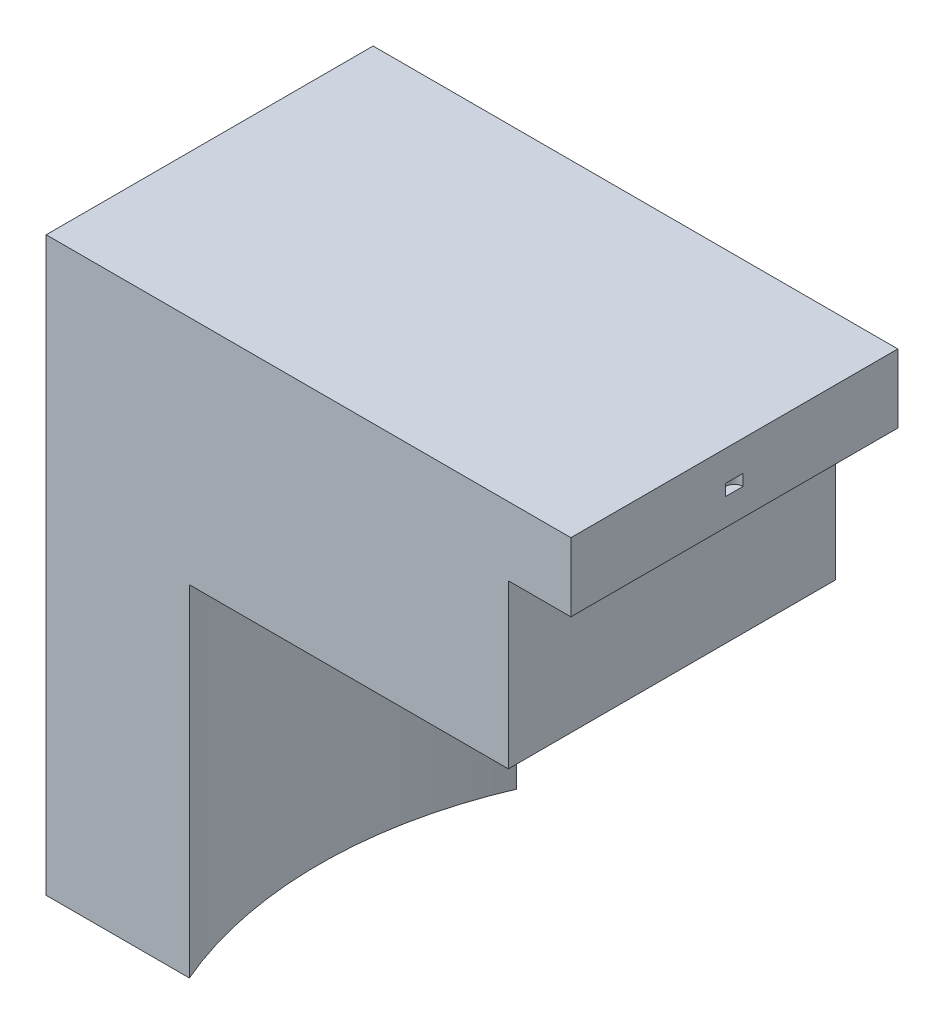
ISO-10303-21;
HEADER;
FILE_DESCRIPTION(('STEP AP214'),'2;1');
FILE_NAME('part.step','',(''),(''),'','','');
FILE_SCHEMA(('AUTOMOTIVE_DESIGN { 1 0 10303 214 1 1 1 1 }'));
ENDSEC;
DATA;
#1=APPLICATION_CONTEXT('core data for automotive mechanical design processes');
#2=APPLICATION_PROTOCOL_DEFINITION('international standard','automotive_design',2000,#1);
#3=PRODUCT_CONTEXT('',#1,'mechanical');
#4=PRODUCT('Part','Part','',(#3));
#5=PRODUCT_RELATED_PRODUCT_CATEGORY('part','',(#4));
#6=PRODUCT_DEFINITION_FORMATION('','',#4);
#7=PRODUCT_DEFINITION_CONTEXT('part definition',#1,'design');
#8=PRODUCT_DEFINITION('design','',#6,#7);
#9=PRODUCT_DEFINITION_SHAPE('','',#8);
#10=(LENGTH_UNIT() NAMED_UNIT(*) SI_UNIT(.MILLI.,.METRE.));
#11=(NAMED_UNIT(*) PLANE_ANGLE_UNIT() SI_UNIT($,.RADIAN.));
#12=(NAMED_UNIT(*) SI_UNIT($,.STERADIAN.) SOLID_ANGLE_UNIT());
#13=UNCERTAINTY_MEASURE_WITH_UNIT(LENGTH_MEASURE(1.E-05),#10,'distance_accuracy_value','');
#14=(GEOMETRIC_REPRESENTATION_CONTEXT(3) GLOBAL_UNCERTAINTY_ASSIGNED_CONTEXT((#13)) GLOBAL_UNIT_ASSIGNED_CONTEXT((#10,
#11,#12)) REPRESENTATION_CONTEXT('',''));
#15=CARTESIAN_POINT('',(0.,0.,0.));
#16=DIRECTION('',(0.,0.,1.));
#17=DIRECTION('',(1.,0.,0.));
#18=AXIS2_PLACEMENT_3D('',#15,#16,#17);
#19=CARTESIAN_POINT('',(0.,2.10095757795159,2.54));
#20=DIRECTION('',(-1.,0.,0.));
#21=DIRECTION('',(0.,0.,1.));
#22=AXIS2_PLACEMENT_3D('',#19,#20,#21);
#23=PLANE('',#22);
#24=DIRECTION('',(0.,1.,0.));
#25=VECTOR('',#24,1.);
#26=CARTESIAN_POINT('',(0.,5.64404138486413,0.135));
#27=LINE('',#26,#25);
#28=CARTESIAN_POINT('',(0.,2.51815975537895,0.135));
#29=VERTEX_POINT('',#28);
#30=CARTESIAN_POINT('',(0.,2.69512166525843,0.135));
#31=VERTEX_POINT('',#30);
#32=EDGE_CURVE('E47',#29,#31,#27,.T.);
#33=ORIENTED_EDGE('',*,*,#32,.T.);
#34=DIRECTION('',(0.,0.,-1.));
#35=VECTOR('',#34,1.);
#36=CARTESIAN_POINT('',(0.,2.69512166525843,2.54));
#37=LINE('',#36,#35);
#38=CARTESIAN_POINT('',(0.,2.69512166525843,-0.135));
#39=VERTEX_POINT('',#38);
#40=EDGE_CURVE('E11',#31,#39,#37,.T.);
#41=ORIENTED_EDGE('',*,*,#40,.T.);
#42=DIRECTION('',(0.,1.,0.));
#43=VECTOR('',#42,1.);
#44=CARTESIAN_POINT('',(0.,5.64404138486413,-0.135));
#45=LINE('',#44,#43);
#46=CARTESIAN_POINT('',(0.,2.51815975537895,-0.135));
#47=VERTEX_POINT('',#46);
#48=EDGE_CURVE('E143',#39,#47,#45,.F.);
#49=ORIENTED_EDGE('',*,*,#48,.T.);
#50=DIRECTION('',(0.,0.,1.));
#51=VECTOR('',#50,1.);
#52=CARTESIAN_POINT('',(0.,2.51815975537895,2.54));
#53=LINE('',#52,#51);
#54=EDGE_CURVE('E139',#47,#29,#53,.T.);
#55=ORIENTED_EDGE('',*,*,#54,.T.);
#56=EDGE_LOOP('',(#33,#41,#49,#55));
#57=FACE_BOUND('',#56,.T.);
#58=DIRECTION('',(0.,1.,0.));
#59=VECTOR('',#58,1.);
#60=CARTESIAN_POINT('',(0.,2.10095757795159,-2.54));
#61=LINE('',#60,#59);
#62=CARTESIAN_POINT('',(0.,2.10095757795159,-2.54));
#63=VERTEX_POINT('',#62);
#64=CARTESIAN_POINT('',(0.,3.16625856266991,-2.54));
#65=VERTEX_POINT('',#64);
#66=EDGE_CURVE('E171',#63,#65,#61,.T.);
#67=ORIENTED_EDGE('',*,*,#66,.T.);
#68=DIRECTION('',(0.,0.,-1.));
#69=VECTOR('',#68,1.);
#70=CARTESIAN_POINT('',(0.,3.16625856266991,2.54));
#71=LINE('',#70,#69);
#72=CARTESIAN_POINT('',(0.,3.16625856266991,2.54));
#73=VERTEX_POINT('',#72);
#74=EDGE_CURVE('E125',#73,#65,#71,.T.);
#75=ORIENTED_EDGE('',*,*,#74,.F.);
#76=DIRECTION('',(0.,1.,0.));
#77=VECTOR('',#76,1.);
#78=CARTESIAN_POINT('',(0.,2.10095757795159,2.54));
#79=LINE('',#78,#77);
#80=CARTESIAN_POINT('',(0.,2.10095757795159,2.54));
#81=VERTEX_POINT('',#80);
#82=EDGE_CURVE('E172',#81,#73,#79,.T.);
#83=ORIENTED_EDGE('',*,*,#82,.F.);
#84=DIRECTION('',(0.,0.,-1.));
#85=VECTOR('',#84,1.);
#86=CARTESIAN_POINT('',(0.,2.10095757795159,2.54));
#87=LINE('',#86,#85);
#88=EDGE_CURVE('E193',#81,#63,#87,.T.);
#89=ORIENTED_EDGE('',*,*,#88,.T.);
#90=EDGE_LOOP('',(#67,#75,#83,#89));
#91=FACE_BOUND('',#90,.T.);
#92=ADVANCED_FACE('F39',(#57,#91),#23,.F.);
#93=CARTESIAN_POINT('',(0.,3.16625856266991,2.54));
#94=DIRECTION('',(0.,-1.,0.));
#95=DIRECTION('',(0.,0.,-1.));
#96=AXIS2_PLACEMENT_3D('',#93,#94,#95);
#97=PLANE('',#96);
#98=DIRECTION('',(-1.,0.,0.));
#99=VECTOR('',#98,1.);
#100=CARTESIAN_POINT('',(0.,3.16625856266991,-2.54));
#101=LINE('',#100,#99);
#102=CARTESIAN_POINT('',(-8.15304288202867,3.16625856266991,-2.54));
#103=VERTEX_POINT('',#102);
#104=EDGE_CURVE('E197',#65,#103,#101,.T.);
#105=ORIENTED_EDGE('',*,*,#104,.T.);
#106=DIRECTION('',(0.,0.,-1.));
#107=VECTOR('',#106,1.);
#108=CARTESIAN_POINT('',(-8.15304288202867,3.16625856266991,2.54));
#109=LINE('',#108,#107);
#110=CARTESIAN_POINT('',(-8.15304288202867,3.16625856266991,2.54));
#111=VERTEX_POINT('',#110);
#112=EDGE_CURVE('E224',#111,#103,#109,.T.);
#113=ORIENTED_EDGE('',*,*,#112,.F.);
#114=DIRECTION('',(-1.,0.,0.));
#115=VECTOR('',#114,1.);
#116=CARTESIAN_POINT('',(0.,3.16625856266991,2.54));
#117=LINE('',#116,#115);
#118=EDGE_CURVE('E176',#73,#111,#117,.T.);
#119=ORIENTED_EDGE('',*,*,#118,.F.);
#120=ORIENTED_EDGE('',*,*,#74,.T.);
#121=EDGE_LOOP('',(#105,#113,#119,#120));
#122=FACE_BOUND('',#121,.T.);
#123=ADVANCED_FACE('F231',(#122),#97,.F.);
#124=CARTESIAN_POINT('',(-8.15304288202867,3.16625856266991,2.54));
#125=DIRECTION('',(1.,0.,0.));
#126=DIRECTION('',(0.,1.,0.));
#127=AXIS2_PLACEMENT_3D('',#124,#125,#126);
#128=PLANE('',#127);
#129=DIRECTION('',(0.,-1.,0.));
#130=VECTOR('',#129,1.);
#131=CARTESIAN_POINT('',(-8.15304288202867,3.16625856266991,-2.54));
#132=LINE('',#131,#130);
#133=CARTESIAN_POINT('',(-8.15304288202867,-5.72374143733008,-2.54));
#134=VERTEX_POINT('',#133);
#135=EDGE_CURVE('E200',#103,#134,#132,.T.);
#136=ORIENTED_EDGE('',*,*,#135,.T.);
#137=DIRECTION('',(0.,0.,-1.));
#138=VECTOR('',#137,1.);
#139=CARTESIAN_POINT('',(-8.15304288202867,-5.72374143733008,2.54));
#140=LINE('',#139,#138);
#141=CARTESIAN_POINT('',(-8.15304288202867,-5.72374143733008,2.54));
#142=VERTEX_POINT('',#141);
#143=EDGE_CURVE('E220',#142,#134,#140,.T.);
#144=ORIENTED_EDGE('',*,*,#143,.F.);
#145=DIRECTION('',(0.,-1.,0.));
#146=VECTOR('',#145,1.);
#147=CARTESIAN_POINT('',(-8.15304288202867,3.16625856266991,2.54));
#148=LINE('',#147,#146);
#149=EDGE_CURVE('E180',#111,#142,#148,.T.);
#150=ORIENTED_EDGE('',*,*,#149,.F.);
#151=ORIENTED_EDGE('',*,*,#112,.T.);
#152=EDGE_LOOP('',(#136,#144,#150,#151));
#153=FACE_BOUND('',#152,.T.);
#154=ADVANCED_FACE('F239',(#153),#128,.F.);
#155=CARTESIAN_POINT('',(-8.15304288202867,-5.72374143733008,2.54));
#156=DIRECTION('',(0.,1.,0.));
#157=DIRECTION('',(-1.,0.,0.));
#158=AXIS2_PLACEMENT_3D('',#155,#156,#157);
#159=PLANE('',#158);
#160=DIRECTION('',(1.,0.,0.));
#161=VECTOR('',#160,1.);
#162=CARTESIAN_POINT('',(-8.15304288202867,-5.72374143733008,-2.54));
#163=LINE('',#162,#161);
#164=CARTESIAN_POINT('',(-5.92881944403774,-5.72374143733008,-2.54));
#165=VERTEX_POINT('',#164);
#166=EDGE_CURVE('E203',#134,#165,#163,.T.);
#167=ORIENTED_EDGE('',*,*,#166,.T.);
#168=CARTESIAN_POINT('',(0.,-5.72374143733008,0.));
#169=DIRECTION('',(0.,1.,0.));
#170=DIRECTION('',(-1.,0.,0.));
#171=AXIS2_PLACEMENT_3D('',#168,#169,#170);
#172=CIRCLE('',#171,6.45);
#173=CARTESIAN_POINT('',(-5.92881944403774,-5.72374143733008,2.54));
#174=VERTEX_POINT('',#173);
#175=EDGE_CURVE('E61',#165,#174,#172,.T.);
#176=ORIENTED_EDGE('',*,*,#175,.T.);
#177=DIRECTION('',(1.,0.,0.));
#178=VECTOR('',#177,1.);
#179=CARTESIAN_POINT('',(-8.15304288202867,-5.72374143733008,2.54));
#180=LINE('',#179,#178);
#181=EDGE_CURVE('E183',#142,#174,#180,.T.);
#182=ORIENTED_EDGE('',*,*,#181,.F.);
#183=ORIENTED_EDGE('',*,*,#143,.T.);
#184=EDGE_LOOP('',(#167,#176,#182,#183));
#185=FACE_BOUND('',#184,.T.);
#186=ADVANCED_FACE('F243',(#185),#159,.F.);
#187=CARTESIAN_POINT('',(-0.971812771881578,-0.430777300864156,2.54));
#188=DIRECTION('',(-1.,0.,0.));
#189=DIRECTION('',(0.,0.,1.));
#190=AXIS2_PLACEMENT_3D('',#187,#188,#189);
#191=PLANE('',#190);
#192=DIRECTION('',(0.,1.,0.));
#193=VECTOR('',#192,1.);
#194=CARTESIAN_POINT('',(-0.971812771881578,-0.430777300864156,-2.54));
#195=LINE('',#194,#193);
#196=CARTESIAN_POINT('',(-0.971812771881578,-0.430777300864156,-2.54));
#197=VERTEX_POINT('',#196);
#198=CARTESIAN_POINT('',(-0.971812771881578,2.10095757795159,-2.54));
#199=VERTEX_POINT('',#198);
#200=EDGE_CURVE('E137',#197,#199,#195,.T.);
#201=ORIENTED_EDGE('',*,*,#200,.T.);
#202=DIRECTION('',(0.,0.,-1.));
#203=VECTOR('',#202,1.);
#204=CARTESIAN_POINT('',(-0.971812771881578,2.10095757795159,2.54));
#205=LINE('',#204,#203);
#206=CARTESIAN_POINT('',(-0.971812771881578,2.10095757795159,2.54));
#207=VERTEX_POINT('',#206);
#208=EDGE_CURVE('E213',#207,#199,#205,.T.);
#209=ORIENTED_EDGE('',*,*,#208,.F.);
#210=DIRECTION('',(0.,1.,0.));
#211=VECTOR('',#210,1.);
#212=CARTESIAN_POINT('',(-0.971812771881578,-0.430777300864156,2.54));
#213=LINE('',#212,#211);
#214=CARTESIAN_POINT('',(-0.971812771881578,-0.430777300864156,2.54));
#215=VERTEX_POINT('',#214);
#216=EDGE_CURVE('E187',#215,#207,#213,.T.);
#217=ORIENTED_EDGE('',*,*,#216,.F.);
#218=DIRECTION('',(0.,0.,-1.));
#219=VECTOR('',#218,1.);
#220=CARTESIAN_POINT('',(-0.971812771881578,-0.430777300864156,2.54));
#221=LINE('',#220,#219);
#222=EDGE_CURVE('E217',#215,#197,#221,.T.);
#223=ORIENTED_EDGE('',*,*,#222,.T.);
#224=EDGE_LOOP('',(#201,#209,#217,#223));
#225=FACE_BOUND('',#224,.T.);
#226=ADVANCED_FACE('F252',(#225),#191,.F.);
#227=CARTESIAN_POINT('',(-0.971812771881578,2.10095757795159,2.54));
#228=DIRECTION('',(0.,1.,0.));
#229=DIRECTION('',(0.,0.,1.));
#230=AXIS2_PLACEMENT_3D('',#227,#228,#229);
#231=PLANE('',#230);
#232=DIRECTION('',(1.,0.,0.));
#233=VECTOR('',#232,1.);
#234=CARTESIAN_POINT('',(-0.971812771881578,2.10095757795159,-2.54));
#235=LINE('',#234,#233);
#236=EDGE_CURVE('E177',#199,#63,#235,.T.);
#237=ORIENTED_EDGE('',*,*,#236,.T.);
#238=ORIENTED_EDGE('',*,*,#88,.F.);
#239=DIRECTION('',(1.,0.,0.));
#240=VECTOR('',#239,1.);
#241=CARTESIAN_POINT('',(-0.971812771881578,2.10095757795159,2.54));
#242=LINE('',#241,#240);
#243=EDGE_CURVE('E190',#207,#81,#242,.T.);
#244=ORIENTED_EDGE('',*,*,#243,.F.);
#245=ORIENTED_EDGE('',*,*,#208,.T.);
#246=EDGE_LOOP('',(#237,#238,#244,#245));
#247=FACE_BOUND('',#246,.T.);
#248=ADVANCED_FACE('F250',(#247),#231,.F.);
#249=CARTESIAN_POINT('',(0.,0.,2.54));
#250=DIRECTION('',(0.,0.,1.));
#251=DIRECTION('',(1.,0.,0.));
#252=AXIS2_PLACEMENT_3D('',#249,#250,#251);
#253=PLANE('',#252);
#254=DIRECTION('',(-1.,0.,0.));
#255=VECTOR('',#254,1.);
#256=CARTESIAN_POINT('',(0.,-0.430777300864156,2.54));
#257=LINE('',#256,#255);
#258=CARTESIAN_POINT('',(-5.92881944403774,-0.430777300864157,2.54));
#259=VERTEX_POINT('',#258);
#260=EDGE_CURVE('E131',#215,#259,#257,.T.);
#261=ORIENTED_EDGE('',*,*,#260,.F.);
#262=ORIENTED_EDGE('',*,*,#216,.T.);
#263=ORIENTED_EDGE('',*,*,#243,.T.);
#264=ORIENTED_EDGE('',*,*,#82,.T.);
#265=ORIENTED_EDGE('',*,*,#118,.T.);
#266=ORIENTED_EDGE('',*,*,#149,.T.);
#267=ORIENTED_EDGE('',*,*,#181,.T.);
#268=DIRECTION('',(0.,1.,0.));
#269=VECTOR('',#268,1.);
#270=CARTESIAN_POINT('',(-5.92881944403774,5.64404138486413,2.54));
#271=LINE('',#270,#269);
#272=EDGE_CURVE('E163',#259,#174,#271,.F.);
#273=ORIENTED_EDGE('',*,*,#272,.F.);
#274=EDGE_LOOP('',(#261,#262,#263,#264,#265,#266,#267,#273));
#275=FACE_BOUND('',#274,.T.);
#276=ADVANCED_FACE('F245',(#275),#253,.T.);
#277=CARTESIAN_POINT('',(0.,0.,-2.54));
#278=DIRECTION('',(0.,0.,1.));
#279=DIRECTION('',(1.,0.,0.));
#280=AXIS2_PLACEMENT_3D('',#277,#278,#279);
#281=PLANE('',#280);
#282=ORIENTED_EDGE('',*,*,#200,.F.);
#283=DIRECTION('',(-1.,0.,0.));
#284=VECTOR('',#283,1.);
#285=CARTESIAN_POINT('',(0.,-0.430777300864156,-2.54));
#286=LINE('',#285,#284);
#287=CARTESIAN_POINT('',(-5.92881944403774,-0.430777300864157,-2.54));
#288=VERTEX_POINT('',#287);
#289=EDGE_CURVE('E124',#197,#288,#286,.T.);
#290=ORIENTED_EDGE('',*,*,#289,.T.);
#291=DIRECTION('',(0.,1.,0.));
#292=VECTOR('',#291,1.);
#293=CARTESIAN_POINT('',(-5.92881944403774,5.64404138486413,-2.54));
#294=LINE('',#293,#292);
#295=EDGE_CURVE('E114',#288,#165,#294,.F.);
#296=ORIENTED_EDGE('',*,*,#295,.T.);
#297=ORIENTED_EDGE('',*,*,#166,.F.);
#298=ORIENTED_EDGE('',*,*,#135,.F.);
#299=ORIENTED_EDGE('',*,*,#104,.F.);
#300=ORIENTED_EDGE('',*,*,#66,.F.);
#301=ORIENTED_EDGE('',*,*,#236,.F.);
#302=EDGE_LOOP('',(#282,#290,#296,#297,#298,#299,#300,#301));
#303=FACE_BOUND('',#302,.T.);
#304=ADVANCED_FACE('F135',(#303),#281,.F.);
#305=CARTESIAN_POINT('',(0.,-0.430777300864156,0.));
#306=DIRECTION('',(0.,1.,0.));
#307=DIRECTION('',(0.,0.,1.));
#308=AXIS2_PLACEMENT_3D('',#305,#306,#307);
#309=PLANE('',#308);
#310=ORIENTED_EDGE('',*,*,#260,.T.);
#311=CARTESIAN_POINT('',(0.,-0.430777300864157,0.));
#312=DIRECTION('',(0.,1.,0.));
#313=DIRECTION('',(0.,0.,1.));
#314=AXIS2_PLACEMENT_3D('',#311,#312,#313);
#315=CIRCLE('',#314,6.45);
#316=EDGE_CURVE('E117',#288,#259,#315,.T.);
#317=ORIENTED_EDGE('',*,*,#316,.F.);
#318=ORIENTED_EDGE('',*,*,#289,.F.);
#319=ORIENTED_EDGE('',*,*,#222,.F.);
#320=EDGE_LOOP('',(#310,#317,#318,#319));
#321=FACE_BOUND('',#320,.T.);
#322=ADVANCED_FACE('F128',(#321),#309,.F.);
#323=CARTESIAN_POINT('',(0.,5.64404138486413,0.));
#324=DIRECTION('',(0.,1.,0.));
#325=DIRECTION('',(0.,0.,1.));
#326=AXIS2_PLACEMENT_3D('',#323,#324,#325);
#327=CYLINDRICAL_SURFACE('',#326,6.45);
#328=ORIENTED_EDGE('',*,*,#272,.T.);
#329=ORIENTED_EDGE('',*,*,#175,.F.);
#330=ORIENTED_EDGE('',*,*,#295,.F.);
#331=ORIENTED_EDGE('',*,*,#316,.T.);
#332=EDGE_LOOP('',(#328,#329,#330,#331));
#333=FACE_BOUND('',#332,.T.);
#334=ADVANCED_FACE('F116',(#333),#327,.F.);
#335=CARTESIAN_POINT('',(0.,2.69512166525843,0.));
#336=DIRECTION('',(0.,1.,0.));
#337=DIRECTION('',(0.,0.,1.));
#338=AXIS2_PLACEMENT_3D('',#335,#336,#337);
#339=PLANE('',#338);
#340=CARTESIAN_POINT('',(0.,2.69512166525843,0.));
#341=DIRECTION('',(0.,1.,0.));
#342=DIRECTION('',(0.,0.,1.));
#343=AXIS2_PLACEMENT_3D('',#340,#341,#342);
#344=CIRCLE('',#343,0.135);
#345=EDGE_CURVE('E157',#39,#31,#344,.T.);
#346=ORIENTED_EDGE('',*,*,#345,.F.);
#347=ORIENTED_EDGE('',*,*,#40,.F.);
#348=EDGE_LOOP('',(#346,#347));
#349=FACE_BOUND('',#348,.T.);
#350=ADVANCED_FACE('F316',(#349),#339,.F.);
#351=CARTESIAN_POINT('',(0.,5.64404138486413,0.));
#352=DIRECTION('',(0.,1.,0.));
#353=DIRECTION('',(0.,0.,1.));
#354=AXIS2_PLACEMENT_3D('',#351,#352,#353);
#355=CYLINDRICAL_SURFACE('',#354,0.135);
#356=CARTESIAN_POINT('',(0.,2.51815975537895,0.));
#357=DIRECTION('',(0.,1.,0.));
#358=DIRECTION('',(0.,0.,1.));
#359=AXIS2_PLACEMENT_3D('',#356,#357,#358);
#360=CIRCLE('',#359,0.135);
#361=EDGE_CURVE('E53',#47,#29,#360,.T.);
#362=ORIENTED_EDGE('',*,*,#361,.F.);
#363=ORIENTED_EDGE('',*,*,#48,.F.);
#364=ORIENTED_EDGE('',*,*,#345,.T.);
#365=ORIENTED_EDGE('',*,*,#32,.F.);
#366=EDGE_LOOP('',(#362,#363,#364,#365));
#367=FACE_BOUND('',#366,.T.);
#368=ADVANCED_FACE('F155',(#367),#355,.F.);
#369=CARTESIAN_POINT('',(-0.135,2.51815975537895,0.));
#370=DIRECTION('',(0.,-1.,0.));
#371=DIRECTION('',(0.,0.,-1.));
#372=AXIS2_PLACEMENT_3D('',#369,#370,#371);
#373=PLANE('',#372);
#374=ORIENTED_EDGE('',*,*,#361,.T.);
#375=ORIENTED_EDGE('',*,*,#54,.F.);
#376=EDGE_LOOP('',(#374,#375));
#377=FACE_BOUND('',#376,.T.);
#378=ADVANCED_FACE('F333',(#377),#373,.F.);
#379=CLOSED_SHELL('',(#92,#123,#154,#186,#226,#248,#276,#304,#322,#334,#350,#368,#378));
#380=MANIFOLD_SOLID_BREP('B2',#379);
#381=ADVANCED_BREP_SHAPE_REPRESENTATION('',(#18,#380),#14);
#382=SHAPE_DEFINITION_REPRESENTATION(#9,#381);
ENDSEC;
END-ISO-10303-21;
